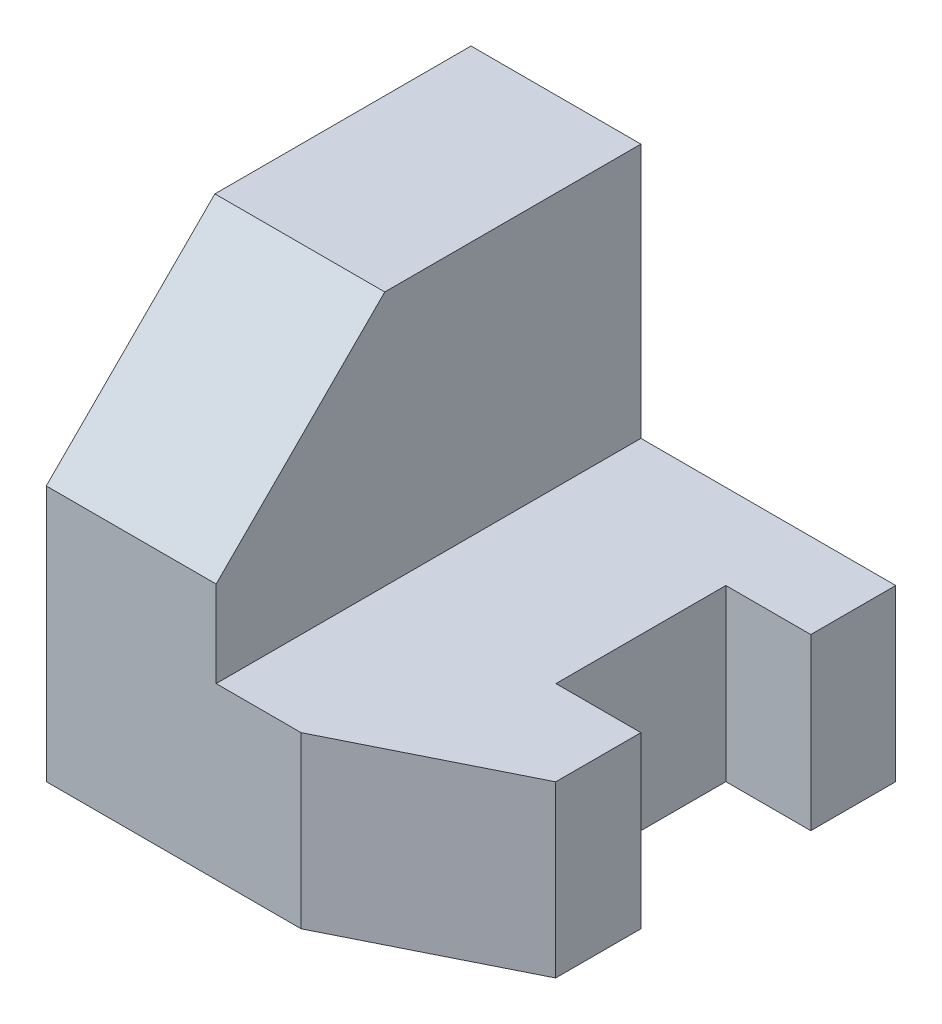
ISO-10303-21;
HEADER;
FILE_DESCRIPTION(('STEP AP214'),'2;1');
FILE_NAME('part.step','',(''),(''),'','','');
FILE_SCHEMA(('AUTOMOTIVE_DESIGN { 1 0 10303 214 1 1 1 1 }'));
ENDSEC;
DATA;
#1=APPLICATION_CONTEXT('core data for automotive mechanical design processes');
#2=APPLICATION_PROTOCOL_DEFINITION('international standard','automotive_design',2000,#1);
#3=PRODUCT_CONTEXT('',#1,'mechanical');
#4=PRODUCT('Part','Part','',(#3));
#5=PRODUCT_RELATED_PRODUCT_CATEGORY('part','',(#4));
#6=PRODUCT_DEFINITION_FORMATION('','',#4);
#7=PRODUCT_DEFINITION_CONTEXT('part definition',#1,'design');
#8=PRODUCT_DEFINITION('design','',#6,#7);
#9=PRODUCT_DEFINITION_SHAPE('','',#8);
#10=(LENGTH_UNIT() NAMED_UNIT(*) SI_UNIT(.MILLI.,.METRE.));
#11=(NAMED_UNIT(*) PLANE_ANGLE_UNIT() SI_UNIT($,.RADIAN.));
#12=(NAMED_UNIT(*) SI_UNIT($,.STERADIAN.) SOLID_ANGLE_UNIT());
#13=UNCERTAINTY_MEASURE_WITH_UNIT(LENGTH_MEASURE(1.E-05),#10,'distance_accuracy_value','');
#14=(GEOMETRIC_REPRESENTATION_CONTEXT(3) GLOBAL_UNCERTAINTY_ASSIGNED_CONTEXT((#13)) GLOBAL_UNIT_ASSIGNED_CONTEXT((#10,
#11,#12)) REPRESENTATION_CONTEXT('',''));
#15=CARTESIAN_POINT('',(0.,0.,0.));
#16=DIRECTION('',(0.,0.,1.));
#17=DIRECTION('',(1.,0.,0.));
#18=AXIS2_PLACEMENT_3D('',#15,#16,#17);
#19=CARTESIAN_POINT('',(-25.,50.,25.));
#20=DIRECTION('',(0.,0.,-1.));
#21=DIRECTION('',(-1.,0.,0.));
#22=AXIS2_PLACEMENT_3D('',#19,#20,#21);
#23=PLANE('',#22);
#24=DIRECTION('',(0.,-1.,0.));
#25=VECTOR('',#24,1.);
#26=CARTESIAN_POINT('',(5.00000000000002,165.753175473055,25.));
#27=LINE('',#26,#25);
#28=CARTESIAN_POINT('',(5.,20.,25.));
#29=VERTEX_POINT('',#28);
#30=CARTESIAN_POINT('',(4.99999999999994,0.,25.));
#31=VERTEX_POINT('',#30);
#32=EDGE_CURVE('E139',#29,#31,#27,.T.);
#33=ORIENTED_EDGE('',*,*,#32,.F.);
#34=DIRECTION('',(1.,0.,0.));
#35=VECTOR('',#34,1.);
#36=CARTESIAN_POINT('',(-5.,20.,25.));
#37=LINE('',#36,#35);
#38=CARTESIAN_POINT('',(-5.,20.,25.));
#39=VERTEX_POINT('',#38);
#40=EDGE_CURVE('E127',#39,#29,#37,.T.);
#41=ORIENTED_EDGE('',*,*,#40,.F.);
#42=DIRECTION('',(0.,-1.,0.));
#43=VECTOR('',#42,1.);
#44=CARTESIAN_POINT('',(-5.00000000000001,50.,25.));
#45=LINE('',#44,#43);
#46=CARTESIAN_POINT('',(-5.,30.1496922231514,25.));
#47=VERTEX_POINT('',#46);
#48=EDGE_CURVE('E136',#47,#39,#45,.T.);
#49=ORIENTED_EDGE('',*,*,#48,.F.);
#50=DIRECTION('',(1.,0.,0.));
#51=VECTOR('',#50,1.);
#52=CARTESIAN_POINT('',(-25.,30.1496922231514,25.));
#53=LINE('',#52,#51);
#54=CARTESIAN_POINT('',(-25.,30.1496922231514,25.));
#55=VERTEX_POINT('',#54);
#56=EDGE_CURVE('E150',#55,#47,#53,.T.);
#57=ORIENTED_EDGE('',*,*,#56,.F.);
#58=DIRECTION('',(0.,-1.,0.));
#59=VECTOR('',#58,1.);
#60=CARTESIAN_POINT('',(-25.,50.,25.));
#61=LINE('',#60,#59);
#62=CARTESIAN_POINT('',(-25.,0.,25.));
#63=VERTEX_POINT('',#62);
#64=EDGE_CURVE('E201',#55,#63,#61,.T.);
#65=ORIENTED_EDGE('',*,*,#64,.T.);
#66=DIRECTION('',(1.,0.,0.));
#67=VECTOR('',#66,1.);
#68=CARTESIAN_POINT('',(-25.,0.,25.));
#69=LINE('',#68,#67);
#70=EDGE_CURVE('E140',#63,#31,#69,.T.);
#71=ORIENTED_EDGE('',*,*,#70,.T.);
#72=EDGE_LOOP('',(#33,#41,#49,#57,#65,#71));
#73=FACE_BOUND('',#72,.T.);
#74=ADVANCED_FACE('F36',(#73),#23,.F.);
#75=CARTESIAN_POINT('',(25.,50.,25.));
#76=DIRECTION('',(-1.,0.,0.));
#77=DIRECTION('',(0.,0.,1.));
#78=AXIS2_PLACEMENT_3D('',#75,#76,#77);
#79=PLANE('',#78);
#80=DIRECTION('',(0.,1.,0.));
#81=VECTOR('',#80,1.);
#82=CARTESIAN_POINT('',(25.,50.,15.0294589300926));
#83=LINE('',#82,#81);
#84=CARTESIAN_POINT('',(25.,0.,15.0294589300926));
#85=VERTEX_POINT('',#84);
#86=CARTESIAN_POINT('',(25.,20.,15.0294589300926));
#87=VERTEX_POINT('',#86);
#88=EDGE_CURVE('E59',#85,#87,#83,.T.);
#89=ORIENTED_EDGE('',*,*,#88,.F.);
#90=DIRECTION('',(0.,0.,-1.));
#91=VECTOR('',#90,1.);
#92=CARTESIAN_POINT('',(25.,0.,25.));
#93=LINE('',#92,#91);
#94=CARTESIAN_POINT('',(25.,0.,4.99999999999999));
#95=VERTEX_POINT('',#94);
#96=EDGE_CURVE('E202',#85,#95,#93,.T.);
#97=ORIENTED_EDGE('',*,*,#96,.T.);
#98=DIRECTION('',(0.,-1.,0.));
#99=VECTOR('',#98,1.);
#100=CARTESIAN_POINT('',(25.,0.,4.99999999999999));
#101=LINE('',#100,#99);
#102=CARTESIAN_POINT('',(25.,20.,5.));
#103=VERTEX_POINT('',#102);
#104=EDGE_CURVE('E160',#103,#95,#101,.T.);
#105=ORIENTED_EDGE('',*,*,#104,.F.);
#106=DIRECTION('',(0.,0.,1.));
#107=VECTOR('',#106,1.);
#108=CARTESIAN_POINT('',(25.,20.,25.));
#109=LINE('',#108,#107);
#110=EDGE_CURVE('E190',#103,#87,#109,.T.);
#111=ORIENTED_EDGE('',*,*,#110,.T.);
#112=EDGE_LOOP('',(#89,#97,#105,#111));
#113=FACE_BOUND('',#112,.T.);
#114=ADVANCED_FACE('F38',(#113),#79,.F.);
#115=CARTESIAN_POINT('',(0.,0.,0.));
#116=DIRECTION('',(0.,-1.,0.));
#117=DIRECTION('',(0.,0.,-1.));
#118=AXIS2_PLACEMENT_3D('',#115,#116,#117);
#119=PLANE('',#118);
#120=ORIENTED_EDGE('',*,*,#96,.F.);
#121=DIRECTION('',(-0.894953856962793,0.,0.446158709325977));
#122=VECTOR('',#121,1.);
#123=CARTESIAN_POINT('',(10.9775744127577,0.,22.0200174409586));
#124=LINE('',#123,#122);
#125=EDGE_CURVE('E51',#85,#31,#124,.T.);
#126=ORIENTED_EDGE('',*,*,#125,.T.);
#127=ORIENTED_EDGE('',*,*,#70,.F.);
#128=DIRECTION('',(0.,0.,1.));
#129=VECTOR('',#128,1.);
#130=CARTESIAN_POINT('',(-25.,0.,25.));
#131=LINE('',#130,#129);
#132=CARTESIAN_POINT('',(-25.,0.,-25.));
#133=VERTEX_POINT('',#132);
#134=EDGE_CURVE('E206',#133,#63,#131,.T.);
#135=ORIENTED_EDGE('',*,*,#134,.F.);
#136=DIRECTION('',(-1.,0.,0.));
#137=VECTOR('',#136,1.);
#138=CARTESIAN_POINT('',(-25.,0.,-25.));
#139=LINE('',#138,#137);
#140=CARTESIAN_POINT('',(25.,0.,-25.));
#141=VERTEX_POINT('',#140);
#142=EDGE_CURVE('E204',#141,#133,#139,.T.);
#143=ORIENTED_EDGE('',*,*,#142,.F.);
#144=CARTESIAN_POINT('',(25.,0.,-15.));
#145=VERTEX_POINT('',#144);
#146=EDGE_CURVE('E195',#145,#141,#93,.T.);
#147=ORIENTED_EDGE('',*,*,#146,.F.);
#148=DIRECTION('',(1.,0.,0.));
#149=VECTOR('',#148,1.);
#150=CARTESIAN_POINT('',(15.,0.,-15.));
#151=LINE('',#150,#149);
#152=CARTESIAN_POINT('',(15.,0.,-15.));
#153=VERTEX_POINT('',#152);
#154=EDGE_CURVE('E173',#153,#145,#151,.T.);
#155=ORIENTED_EDGE('',*,*,#154,.F.);
#156=DIRECTION('',(0.,0.,-1.));
#157=VECTOR('',#156,1.);
#158=CARTESIAN_POINT('',(15.,0.,-15.));
#159=LINE('',#158,#157);
#160=CARTESIAN_POINT('',(15.,0.,4.99999999999999));
#161=VERTEX_POINT('',#160);
#162=EDGE_CURVE('E166',#161,#153,#159,.T.);
#163=ORIENTED_EDGE('',*,*,#162,.F.);
#164=DIRECTION('',(1.,0.,0.));
#165=VECTOR('',#164,1.);
#166=CARTESIAN_POINT('',(15.,0.,4.99999999999999));
#167=LINE('',#166,#165);
#168=EDGE_CURVE('E175',#161,#95,#167,.T.);
#169=ORIENTED_EDGE('',*,*,#168,.T.);
#170=EDGE_LOOP('',(#120,#126,#127,#135,#143,#147,#155,#163,#169));
#171=FACE_BOUND('',#170,.T.);
#172=ADVANCED_FACE('F230',(#171),#119,.T.);
#173=CARTESIAN_POINT('',(-5.,20.,-25.));
#174=DIRECTION('',(0.,-1.,0.));
#175=DIRECTION('',(1.,0.,0.));
#176=AXIS2_PLACEMENT_3D('',#173,#174,#175);
#177=PLANE('',#176);
#178=DIRECTION('',(-0.894953856962793,0.,0.446158709325977));
#179=VECTOR('',#178,1.);
#180=CARTESIAN_POINT('',(16.9551488255154,20.,19.0400348819172));
#181=LINE('',#180,#179);
#182=EDGE_CURVE('E11',#87,#29,#181,.T.);
#183=ORIENTED_EDGE('',*,*,#182,.F.);
#184=ORIENTED_EDGE('',*,*,#110,.F.);
#185=DIRECTION('',(1.,0.,0.));
#186=VECTOR('',#185,1.);
#187=CARTESIAN_POINT('',(15.,20.,5.));
#188=LINE('',#187,#186);
#189=CARTESIAN_POINT('',(15.,20.,5.));
#190=VERTEX_POINT('',#189);
#191=EDGE_CURVE('E178',#190,#103,#188,.T.);
#192=ORIENTED_EDGE('',*,*,#191,.F.);
#193=DIRECTION('',(0.,0.,1.));
#194=VECTOR('',#193,1.);
#195=CARTESIAN_POINT('',(15.,20.,-15.));
#196=LINE('',#195,#194);
#197=CARTESIAN_POINT('',(15.,20.,-15.));
#198=VERTEX_POINT('',#197);
#199=EDGE_CURVE('E159',#198,#190,#196,.T.);
#200=ORIENTED_EDGE('',*,*,#199,.F.);
#201=DIRECTION('',(1.,0.,0.));
#202=VECTOR('',#201,1.);
#203=CARTESIAN_POINT('',(15.,20.,-15.));
#204=LINE('',#203,#202);
#205=CARTESIAN_POINT('',(25.,20.,-15.));
#206=VERTEX_POINT('',#205);
#207=EDGE_CURVE('E169',#198,#206,#204,.T.);
#208=ORIENTED_EDGE('',*,*,#207,.T.);
#209=CARTESIAN_POINT('',(25.,20.,-25.));
#210=VERTEX_POINT('',#209);
#211=EDGE_CURVE('E192',#210,#206,#109,.T.);
#212=ORIENTED_EDGE('',*,*,#211,.F.);
#213=DIRECTION('',(1.,0.,0.));
#214=VECTOR('',#213,1.);
#215=CARTESIAN_POINT('',(-5.,20.,-25.));
#216=LINE('',#215,#214);
#217=CARTESIAN_POINT('',(-5.,20.,-25.));
#218=VERTEX_POINT('',#217);
#219=EDGE_CURVE('E184',#218,#210,#216,.T.);
#220=ORIENTED_EDGE('',*,*,#219,.F.);
#221=DIRECTION('',(0.,0.,1.));
#222=VECTOR('',#221,1.);
#223=CARTESIAN_POINT('',(-5.,20.,-25.));
#224=LINE('',#223,#222);
#225=EDGE_CURVE('E132',#218,#39,#224,.T.);
#226=ORIENTED_EDGE('',*,*,#225,.T.);
#227=ORIENTED_EDGE('',*,*,#40,.T.);
#228=EDGE_LOOP('',(#183,#184,#192,#200,#208,#212,#220,#226,#227));
#229=FACE_BOUND('',#228,.T.);
#230=ADVANCED_FACE('F129',(#229),#177,.F.);
#231=CARTESIAN_POINT('',(-25.,50.,25.));
#232=DIRECTION('',(1.,0.,0.));
#233=DIRECTION('',(0.,0.,-1.));
#234=AXIS2_PLACEMENT_3D('',#231,#232,#233);
#235=PLANE('',#234);
#236=DIRECTION('',(0.,-0.707106781186549,0.707106781186546));
#237=VECTOR('',#236,1.);
#238=CARTESIAN_POINT('',(-25.,40.0748461115757,15.0748461115757));
#239=LINE('',#238,#237);
#240=CARTESIAN_POINT('',(-25.,50.,5.14969222315141));
#241=VERTEX_POINT('',#240);
#242=EDGE_CURVE('E153',#241,#55,#239,.T.);
#243=ORIENTED_EDGE('',*,*,#242,.F.);
#244=DIRECTION('',(0.,0.,1.));
#245=VECTOR('',#244,1.);
#246=CARTESIAN_POINT('',(-25.,50.,25.));
#247=LINE('',#246,#245);
#248=CARTESIAN_POINT('',(-25.,50.,-25.));
#249=VERTEX_POINT('',#248);
#250=EDGE_CURVE('E198',#249,#241,#247,.T.);
#251=ORIENTED_EDGE('',*,*,#250,.F.);
#252=DIRECTION('',(0.,-1.,0.));
#253=VECTOR('',#252,1.);
#254=CARTESIAN_POINT('',(-25.,50.,-25.));
#255=LINE('',#254,#253);
#256=EDGE_CURVE('E211',#249,#133,#255,.T.);
#257=ORIENTED_EDGE('',*,*,#256,.T.);
#258=ORIENTED_EDGE('',*,*,#134,.T.);
#259=ORIENTED_EDGE('',*,*,#64,.F.);
#260=EDGE_LOOP('',(#243,#251,#257,#258,#259));
#261=FACE_BOUND('',#260,.T.);
#262=ADVANCED_FACE('F225',(#261),#235,.F.);
#263=CARTESIAN_POINT('',(0.,50.,0.));
#264=DIRECTION('',(0.,-1.,0.));
#265=DIRECTION('',(0.,0.,-1.));
#266=AXIS2_PLACEMENT_3D('',#263,#264,#265);
#267=PLANE('',#266);
#268=DIRECTION('',(-1.,0.,0.));
#269=VECTOR('',#268,1.);
#270=CARTESIAN_POINT('',(0.,50.,5.14969222315142));
#271=LINE('',#270,#269);
#272=CARTESIAN_POINT('',(-5.00000000000001,50.,5.14969222315142));
#273=VERTEX_POINT('',#272);
#274=EDGE_CURVE('E145',#273,#241,#271,.T.);
#275=ORIENTED_EDGE('',*,*,#274,.F.);
#276=DIRECTION('',(0.,0.,1.));
#277=VECTOR('',#276,1.);
#278=CARTESIAN_POINT('',(-5.00000000000001,50.,-25.));
#279=LINE('',#278,#277);
#280=CARTESIAN_POINT('',(-5.00000000000001,50.,-25.));
#281=VERTEX_POINT('',#280);
#282=EDGE_CURVE('E187',#281,#273,#279,.T.);
#283=ORIENTED_EDGE('',*,*,#282,.F.);
#284=DIRECTION('',(-1.,0.,0.));
#285=VECTOR('',#284,1.);
#286=CARTESIAN_POINT('',(-25.,50.,-25.));
#287=LINE('',#286,#285);
#288=EDGE_CURVE('E196',#281,#249,#287,.T.);
#289=ORIENTED_EDGE('',*,*,#288,.T.);
#290=ORIENTED_EDGE('',*,*,#250,.T.);
#291=EDGE_LOOP('',(#275,#283,#289,#290));
#292=FACE_BOUND('',#291,.T.);
#293=ADVANCED_FACE('F246',(#292),#267,.F.);
#294=CARTESIAN_POINT('',(-5.00000000000001,50.,-25.));
#295=DIRECTION('',(-1.,0.,0.));
#296=DIRECTION('',(0.,-1.,0.));
#297=AXIS2_PLACEMENT_3D('',#294,#295,#296);
#298=PLANE('',#297);
#299=DIRECTION('',(0.,0.707106781186549,-0.707106781186546));
#300=VECTOR('',#299,1.);
#301=CARTESIAN_POINT('',(-5.00000000000001,65.0748461115757,-9.92515388842424));
#302=LINE('',#301,#300);
#303=EDGE_CURVE('E44',#47,#273,#302,.T.);
#304=ORIENTED_EDGE('',*,*,#303,.F.);
#305=ORIENTED_EDGE('',*,*,#48,.T.);
#306=ORIENTED_EDGE('',*,*,#225,.F.);
#307=DIRECTION('',(0.,-1.,0.));
#308=VECTOR('',#307,1.);
#309=CARTESIAN_POINT('',(-5.00000000000001,50.,-25.));
#310=LINE('',#309,#308);
#311=EDGE_CURVE('E135',#281,#218,#310,.T.);
#312=ORIENTED_EDGE('',*,*,#311,.F.);
#313=ORIENTED_EDGE('',*,*,#282,.T.);
#314=EDGE_LOOP('',(#304,#305,#306,#312,#313));
#315=FACE_BOUND('',#314,.T.);
#316=ADVANCED_FACE('F221',(#315),#298,.F.);
#317=ORIENTED_EDGE('',*,*,#211,.T.);
#318=DIRECTION('',(0.,1.,0.));
#319=VECTOR('',#318,1.);
#320=CARTESIAN_POINT('',(25.,0.,-15.));
#321=LINE('',#320,#319);
#322=EDGE_CURVE('E156',#145,#206,#321,.T.);
#323=ORIENTED_EDGE('',*,*,#322,.F.);
#324=ORIENTED_EDGE('',*,*,#146,.T.);
#325=DIRECTION('',(0.,-1.,0.));
#326=VECTOR('',#325,1.);
#327=CARTESIAN_POINT('',(25.,50.,-25.));
#328=LINE('',#327,#326);
#329=EDGE_CURVE('E214',#210,#141,#328,.T.);
#330=ORIENTED_EDGE('',*,*,#329,.F.);
#331=EDGE_LOOP('',(#317,#323,#324,#330));
#332=FACE_BOUND('',#331,.T.);
#333=ADVANCED_FACE('F238',(#332),#79,.F.);
#334=CARTESIAN_POINT('',(-25.,50.,-25.));
#335=DIRECTION('',(0.,0.,1.));
#336=DIRECTION('',(1.,0.,0.));
#337=AXIS2_PLACEMENT_3D('',#334,#335,#336);
#338=PLANE('',#337);
#339=ORIENTED_EDGE('',*,*,#311,.T.);
#340=ORIENTED_EDGE('',*,*,#219,.T.);
#341=ORIENTED_EDGE('',*,*,#329,.T.);
#342=ORIENTED_EDGE('',*,*,#142,.T.);
#343=ORIENTED_EDGE('',*,*,#256,.F.);
#344=ORIENTED_EDGE('',*,*,#288,.F.);
#345=EDGE_LOOP('',(#339,#340,#341,#342,#343,#344));
#346=FACE_BOUND('',#345,.T.);
#347=ADVANCED_FACE('F247',(#346),#338,.F.);
#348=CARTESIAN_POINT('',(15.,0.,-15.));
#349=DIRECTION('',(0.,0.,-1.));
#350=DIRECTION('',(-1.,0.,0.));
#351=AXIS2_PLACEMENT_3D('',#348,#349,#350);
#352=PLANE('',#351);
#353=ORIENTED_EDGE('',*,*,#322,.T.);
#354=ORIENTED_EDGE('',*,*,#207,.F.);
#355=DIRECTION('',(0.,1.,0.));
#356=VECTOR('',#355,1.);
#357=CARTESIAN_POINT('',(15.,0.,-15.));
#358=LINE('',#357,#356);
#359=EDGE_CURVE('E157',#153,#198,#358,.T.);
#360=ORIENTED_EDGE('',*,*,#359,.F.);
#361=ORIENTED_EDGE('',*,*,#154,.T.);
#362=EDGE_LOOP('',(#353,#354,#360,#361));
#363=FACE_BOUND('',#362,.T.);
#364=ADVANCED_FACE('F249',(#363),#352,.F.);
#365=CARTESIAN_POINT('',(15.,0.,4.99999999999999));
#366=DIRECTION('',(0.,0.,1.));
#367=DIRECTION('',(0.,-1.,0.));
#368=AXIS2_PLACEMENT_3D('',#365,#366,#367);
#369=PLANE('',#368);
#370=ORIENTED_EDGE('',*,*,#104,.T.);
#371=ORIENTED_EDGE('',*,*,#168,.F.);
#372=DIRECTION('',(0.,-1.,0.));
#373=VECTOR('',#372,1.);
#374=CARTESIAN_POINT('',(15.,0.,4.99999999999999));
#375=LINE('',#374,#373);
#376=EDGE_CURVE('E163',#190,#161,#375,.T.);
#377=ORIENTED_EDGE('',*,*,#376,.F.);
#378=ORIENTED_EDGE('',*,*,#191,.T.);
#379=EDGE_LOOP('',(#370,#371,#377,#378));
#380=FACE_BOUND('',#379,.T.);
#381=ADVANCED_FACE('F255',(#380),#369,.F.);
#382=CARTESIAN_POINT('',(15.,0.,0.));
#383=DIRECTION('',(1.,0.,0.));
#384=DIRECTION('',(0.,0.,-1.));
#385=AXIS2_PLACEMENT_3D('',#382,#383,#384);
#386=PLANE('',#385);
#387=ORIENTED_EDGE('',*,*,#359,.T.);
#388=ORIENTED_EDGE('',*,*,#199,.T.);
#389=ORIENTED_EDGE('',*,*,#376,.T.);
#390=ORIENTED_EDGE('',*,*,#162,.T.);
#391=EDGE_LOOP('',(#387,#388,#389,#390));
#392=FACE_BOUND('',#391,.T.);
#393=ADVANCED_FACE('F270',(#392),#386,.T.);
#394=CARTESIAN_POINT('',(140.753175473055,30.,25.1496922231514));
#395=DIRECTION('',(0.,0.707106781186546,0.707106781186549));
#396=DIRECTION('',(0.,-0.707106781186549,0.707106781186546));
#397=AXIS2_PLACEMENT_3D('',#394,#395,#396);
#398=PLANE('',#397);
#399=ORIENTED_EDGE('',*,*,#274,.T.);
#400=ORIENTED_EDGE('',*,*,#242,.T.);
#401=ORIENTED_EDGE('',*,*,#56,.T.);
#402=ORIENTED_EDGE('',*,*,#303,.T.);
#403=EDGE_LOOP('',(#399,#400,#401,#402));
#404=FACE_BOUND('',#403,.T.);
#405=ADVANCED_FACE('F218',(#404),#398,.T.);
#406=CARTESIAN_POINT('',(25.0590919387144,165.753175473055,15.));
#407=DIRECTION('',(0.446158709325977,0.,0.894953856962793));
#408=DIRECTION('',(0.894953856962793,0.,-0.446158709325977));
#409=AXIS2_PLACEMENT_3D('',#406,#407,#408);
#410=PLANE('',#409);
#411=ORIENTED_EDGE('',*,*,#125,.F.);
#412=ORIENTED_EDGE('',*,*,#88,.T.);
#413=ORIENTED_EDGE('',*,*,#182,.T.);
#414=ORIENTED_EDGE('',*,*,#32,.T.);
#415=EDGE_LOOP('',(#411,#412,#413,#414));
#416=FACE_BOUND('',#415,.T.);
#417=ADVANCED_FACE('F143',(#416),#410,.T.);
#418=CLOSED_SHELL('',(#74,#114,#172,#230,#262,#293,#316,#333,#347,#364,#381,#393,#405,#417));
#419=MANIFOLD_SOLID_BREP('B2',#418);
#420=ADVANCED_BREP_SHAPE_REPRESENTATION('',(#18,#419),#14);
#421=SHAPE_DEFINITION_REPRESENTATION(#9,#420);
ENDSEC;
END-ISO-10303-21;
